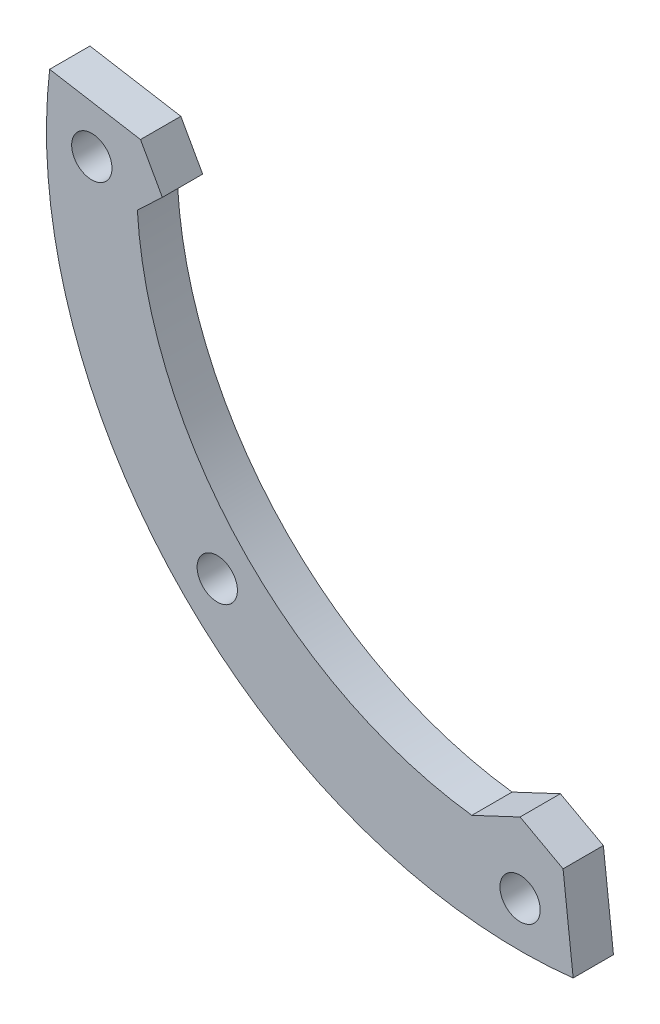
ISO-10303-21;
HEADER;
FILE_DESCRIPTION(('STEP AP214'),'2;1');
FILE_NAME('part.step','',(''),(''),'','','');
FILE_SCHEMA(('AUTOMOTIVE_DESIGN { 1 0 10303 214 1 1 1 1 }'));
ENDSEC;
DATA;
#1=APPLICATION_CONTEXT('core data for automotive mechanical design processes');
#2=APPLICATION_PROTOCOL_DEFINITION('international standard','automotive_design',2000,#1);
#3=PRODUCT_CONTEXT('',#1,'mechanical');
#4=PRODUCT('Part','Part','',(#3));
#5=PRODUCT_RELATED_PRODUCT_CATEGORY('part','',(#4));
#6=PRODUCT_DEFINITION_FORMATION('','',#4);
#7=PRODUCT_DEFINITION_CONTEXT('part definition',#1,'design');
#8=PRODUCT_DEFINITION('design','',#6,#7);
#9=PRODUCT_DEFINITION_SHAPE('','',#8);
#10=(LENGTH_UNIT() NAMED_UNIT(*) SI_UNIT(.MILLI.,.METRE.));
#11=(NAMED_UNIT(*) PLANE_ANGLE_UNIT() SI_UNIT($,.RADIAN.));
#12=(NAMED_UNIT(*) SI_UNIT($,.STERADIAN.) SOLID_ANGLE_UNIT());
#13=UNCERTAINTY_MEASURE_WITH_UNIT(LENGTH_MEASURE(1.E-05),#10,'distance_accuracy_value','');
#14=(GEOMETRIC_REPRESENTATION_CONTEXT(3) GLOBAL_UNCERTAINTY_ASSIGNED_CONTEXT((#13)) GLOBAL_UNIT_ASSIGNED_CONTEXT((#10,
#11,#12)) REPRESENTATION_CONTEXT('',''));
#15=CARTESIAN_POINT('',(0.,0.,0.));
#16=DIRECTION('',(0.,0.,1.));
#17=DIRECTION('',(1.,0.,0.));
#18=AXIS2_PLACEMENT_3D('',#15,#16,#17);
#19=CARTESIAN_POINT('',(0.,53.009783314729,4.));
#20=DIRECTION('',(0.,0.,1.));
#21=DIRECTION('',(1.,0.,0.));
#22=AXIS2_PLACEMENT_3D('',#19,#20,#21);
#23=PLANE('',#22);
#24=CARTESIAN_POINT('',(-30.0520382004283,22.9577451143008,4.));
#25=DIRECTION('',(0.,0.,1.));
#26=DIRECTION('',(1.,0.,0.));
#27=AXIS2_PLACEMENT_3D('',#24,#25,#26);
#28=CIRCLE('',#27,2.);
#29=CARTESIAN_POINT('',(-28.0520382004283,22.9577451143008,4.));
#30=VERTEX_POINT('',#29);
#31=EDGE_CURVE('E182',#30,#30,#28,.T.);
#32=ORIENTED_EDGE('',*,*,#31,.F.);
#33=EDGE_LOOP('',(#32));
#34=FACE_BOUND('',#33,.T.);
#35=DIRECTION('',(0.729145399655738,0.684358813898728,0.));
#36=VECTOR('',#35,1.);
#37=CARTESIAN_POINT('',(-35.5,53.0097833147292,4.));
#38=LINE('',#37,#36);
#39=CARTESIAN_POINT('',(-37.9833457303055,50.6789731096661,4.));
#40=VERTEX_POINT('',#39);
#41=CARTESIAN_POINT('',(-35.5,53.0097833147292,4.));
#42=VERTEX_POINT('',#41);
#43=EDGE_CURVE('E145',#40,#42,#38,.T.);
#44=ORIENTED_EDGE('',*,*,#43,.T.);
#45=DIRECTION('',(-0.486980783769737,0.873412683809328,0.));
#46=VECTOR('',#45,1.);
#47=CARTESIAN_POINT('',(-37.6674058612895,56.8970820199446,4.));
#48=LINE('',#47,#46);
#49=CARTESIAN_POINT('',(-37.6674058612895,56.8970820199446,4.));
#50=VERTEX_POINT('',#49);
#51=EDGE_CURVE('E93',#42,#50,#48,.T.);
#52=ORIENTED_EDGE('',*,*,#51,.T.);
#53=DIRECTION('',(-0.985929303058029,0.167162822934733,0.));
#54=VECTOR('',#53,1.);
#55=CARTESIAN_POINT('',(-37.6674058612895,56.8970820199446,4.));
#56=LINE('',#55,#54);
#57=CARTESIAN_POINT('',(-46.6868418083701,58.4263137503705,4.));
#58=VERTEX_POINT('',#57);
#59=EDGE_CURVE('E160',#50,#58,#56,.T.);
#60=ORIENTED_EDGE('',*,*,#59,.T.);
#61=CARTESIAN_POINT('',(0.,53.009783314729,4.));
#62=DIRECTION('',(0.,0.,1.));
#63=DIRECTION('',(-1.,0.,0.));
#64=AXIS2_PLACEMENT_3D('',#61,#62,#63);
#65=CIRCLE('',#64,47.);
#66=CARTESIAN_POINT('',(5.26727650502577,6.30586700978083,4.));
#67=VERTEX_POINT('',#66);
#68=EDGE_CURVE('E173',#58,#67,#65,.T.);
#69=ORIENTED_EDGE('',*,*,#68,.T.);
#70=DIRECTION('',(-0.112069712872889,0.993700346913791,0.));
#71=VECTOR('',#70,1.);
#72=CARTESIAN_POINT('',(4.26553777903046,15.1880894588341,4.));
#73=LINE('',#72,#71);
#74=CARTESIAN_POINT('',(4.26553777903046,15.1880894588341,4.));
#75=VERTEX_POINT('',#74);
#76=EDGE_CURVE('E112',#67,#75,#73,.T.);
#77=ORIENTED_EDGE('',*,*,#76,.T.);
#78=DIRECTION('',(-0.87832483509759,0.478064309534598,0.));
#79=VECTOR('',#78,1.);
#80=CARTESIAN_POINT('',(4.26553777903046,15.1880894588341,4.));
#81=LINE('',#80,#79);
#82=CARTESIAN_POINT('',(0.,17.509783314729,4.));
#83=VERTEX_POINT('',#82);
#84=EDGE_CURVE('E106',#75,#83,#81,.T.);
#85=ORIENTED_EDGE('',*,*,#84,.T.);
#86=DIRECTION('',(-0.904918159738496,-0.425585624963408,0.));
#87=VECTOR('',#86,1.);
#88=CARTESIAN_POINT('',(0.,17.509783314729,4.));
#89=LINE('',#88,#87);
#90=CARTESIAN_POINT('',(-4.7889561391317,15.257523406514,4.));
#91=VERTEX_POINT('',#90);
#92=EDGE_CURVE('E110',#83,#91,#89,.T.);
#93=ORIENTED_EDGE('',*,*,#92,.T.);
#94=CARTESIAN_POINT('',(0.,53.009783314729,4.));
#95=DIRECTION('',(0.,0.,-1.));
#96=DIRECTION('',(1.,0.,0.));
#97=AXIS2_PLACEMENT_3D('',#94,#95,#96);
#98=CIRCLE('',#97,38.0547924587685);
#99=EDGE_CURVE('E50',#91,#40,#98,.T.);
#100=ORIENTED_EDGE('',*,*,#99,.T.);
#101=EDGE_LOOP('',(#44,#52,#60,#69,#77,#85,#93,#100));
#102=FACE_BOUND('',#101,.T.);
#103=CARTESIAN_POINT('',(0.,10.509783314729,4.));
#104=DIRECTION('',(0.,0.,1.));
#105=DIRECTION('',(1.,0.,0.));
#106=AXIS2_PLACEMENT_3D('',#103,#104,#105);
#107=CIRCLE('',#106,2.);
#108=CARTESIAN_POINT('',(2.,10.509783314729,4.));
#109=VERTEX_POINT('',#108);
#110=EDGE_CURVE('E134',#109,#109,#107,.T.);
#111=ORIENTED_EDGE('',*,*,#110,.F.);
#112=EDGE_LOOP('',(#111));
#113=FACE_BOUND('',#112,.T.);
#114=CARTESIAN_POINT('',(-42.5,53.0097833147292,4.));
#115=DIRECTION('',(0.,0.,1.));
#116=DIRECTION('',(1.,0.,0.));
#117=AXIS2_PLACEMENT_3D('',#114,#115,#116);
#118=CIRCLE('',#117,2.);
#119=CARTESIAN_POINT('',(-40.5,53.0097833147292,4.));
#120=VERTEX_POINT('',#119);
#121=EDGE_CURVE('E188',#120,#120,#118,.T.);
#122=ORIENTED_EDGE('',*,*,#121,.F.);
#123=EDGE_LOOP('',(#122));
#124=FACE_BOUND('',#123,.T.);
#125=ADVANCED_FACE('F33',(#34,#102,#113,#124),#23,.T.);
#126=CARTESIAN_POINT('',(0.,53.009783314729,0.));
#127=DIRECTION('',(0.,0.,1.));
#128=DIRECTION('',(1.,0.,0.));
#129=AXIS2_PLACEMENT_3D('',#126,#127,#128);
#130=PLANE('',#129);
#131=DIRECTION('',(0.729145399655738,0.684358813898728,0.));
#132=VECTOR('',#131,1.);
#133=CARTESIAN_POINT('',(-35.5,53.0097833147292,0.));
#134=LINE('',#133,#132);
#135=CARTESIAN_POINT('',(-37.9833457303055,50.6789731096661,0.));
#136=VERTEX_POINT('',#135);
#137=CARTESIAN_POINT('',(-35.5,53.0097833147292,0.));
#138=VERTEX_POINT('',#137);
#139=EDGE_CURVE('E130',#136,#138,#134,.T.);
#140=ORIENTED_EDGE('',*,*,#139,.F.);
#141=CARTESIAN_POINT('',(0.,53.009783314729,0.));
#142=DIRECTION('',(0.,0.,-1.));
#143=DIRECTION('',(1.,0.,0.));
#144=AXIS2_PLACEMENT_3D('',#141,#142,#143);
#145=CIRCLE('',#144,38.0547924587685);
#146=CARTESIAN_POINT('',(-4.7889561391317,15.257523406514,0.));
#147=VERTEX_POINT('',#146);
#148=EDGE_CURVE('E85',#147,#136,#145,.T.);
#149=ORIENTED_EDGE('',*,*,#148,.F.);
#150=DIRECTION('',(-0.904918159738496,-0.425585624963408,0.));
#151=VECTOR('',#150,1.);
#152=CARTESIAN_POINT('',(0.,17.509783314729,0.));
#153=LINE('',#152,#151);
#154=CARTESIAN_POINT('',(0.,17.509783314729,0.));
#155=VERTEX_POINT('',#154);
#156=EDGE_CURVE('E79',#155,#147,#153,.T.);
#157=ORIENTED_EDGE('',*,*,#156,.F.);
#158=DIRECTION('',(-0.87832483509759,0.478064309534598,0.));
#159=VECTOR('',#158,1.);
#160=CARTESIAN_POINT('',(4.26553777903046,15.1880894588341,0.));
#161=LINE('',#160,#159);
#162=CARTESIAN_POINT('',(4.26553777903046,15.1880894588341,0.));
#163=VERTEX_POINT('',#162);
#164=EDGE_CURVE('E120',#163,#155,#161,.T.);
#165=ORIENTED_EDGE('',*,*,#164,.F.);
#166=DIRECTION('',(-0.112069712872889,0.993700346913791,0.));
#167=VECTOR('',#166,1.);
#168=CARTESIAN_POINT('',(4.26553777903046,15.1880894588341,0.));
#169=LINE('',#168,#167);
#170=CARTESIAN_POINT('',(5.26727650502577,6.30586700978083,0.));
#171=VERTEX_POINT('',#170);
#172=EDGE_CURVE('E140',#171,#163,#169,.T.);
#173=ORIENTED_EDGE('',*,*,#172,.F.);
#174=CARTESIAN_POINT('',(0.,53.009783314729,0.));
#175=DIRECTION('',(0.,0.,1.));
#176=DIRECTION('',(-1.,0.,0.));
#177=AXIS2_PLACEMENT_3D('',#174,#175,#176);
#178=CIRCLE('',#177,47.);
#179=CARTESIAN_POINT('',(-46.6868418083701,58.4263137503705,0.));
#180=VERTEX_POINT('',#179);
#181=EDGE_CURVE('E138',#180,#171,#178,.T.);
#182=ORIENTED_EDGE('',*,*,#181,.F.);
#183=DIRECTION('',(-0.985929303058029,0.167162822934733,0.));
#184=VECTOR('',#183,1.);
#185=CARTESIAN_POINT('',(-37.6674058612895,56.8970820199446,0.));
#186=LINE('',#185,#184);
#187=CARTESIAN_POINT('',(-37.6674058612895,56.8970820199446,0.));
#188=VERTEX_POINT('',#187);
#189=EDGE_CURVE('E136',#188,#180,#186,.T.);
#190=ORIENTED_EDGE('',*,*,#189,.F.);
#191=DIRECTION('',(-0.486980783769737,0.873412683809328,0.));
#192=VECTOR('',#191,1.);
#193=CARTESIAN_POINT('',(-37.6674058612895,56.8970820199446,0.));
#194=LINE('',#193,#192);
#195=EDGE_CURVE('E133',#138,#188,#194,.T.);
#196=ORIENTED_EDGE('',*,*,#195,.F.);
#197=EDGE_LOOP('',(#140,#149,#157,#165,#173,#182,#190,#196));
#198=FACE_BOUND('',#197,.T.);
#199=CARTESIAN_POINT('',(0.,10.509783314729,0.));
#200=DIRECTION('',(0.,0.,1.));
#201=DIRECTION('',(1.,0.,0.));
#202=AXIS2_PLACEMENT_3D('',#199,#200,#201);
#203=CIRCLE('',#202,2.);
#204=CARTESIAN_POINT('',(2.,10.509783314729,0.));
#205=VERTEX_POINT('',#204);
#206=EDGE_CURVE('E179',#205,#205,#203,.T.);
#207=ORIENTED_EDGE('',*,*,#206,.T.);
#208=EDGE_LOOP('',(#207));
#209=FACE_BOUND('',#208,.T.);
#210=CARTESIAN_POINT('',(-30.0520382004283,22.9577451143008,0.));
#211=DIRECTION('',(0.,0.,1.));
#212=DIRECTION('',(1.,0.,0.));
#213=AXIS2_PLACEMENT_3D('',#210,#211,#212);
#214=CIRCLE('',#213,2.);
#215=CARTESIAN_POINT('',(-28.0520382004283,22.9577451143008,0.));
#216=VERTEX_POINT('',#215);
#217=EDGE_CURVE('E185',#216,#216,#214,.T.);
#218=ORIENTED_EDGE('',*,*,#217,.T.);
#219=EDGE_LOOP('',(#218));
#220=FACE_BOUND('',#219,.T.);
#221=CARTESIAN_POINT('',(-42.5,53.0097833147292,0.));
#222=DIRECTION('',(0.,0.,1.));
#223=DIRECTION('',(1.,0.,0.));
#224=AXIS2_PLACEMENT_3D('',#221,#222,#223);
#225=CIRCLE('',#224,2.);
#226=CARTESIAN_POINT('',(-40.5,53.0097833147292,0.));
#227=VERTEX_POINT('',#226);
#228=EDGE_CURVE('E191',#227,#227,#225,.T.);
#229=ORIENTED_EDGE('',*,*,#228,.T.);
#230=EDGE_LOOP('',(#229));
#231=FACE_BOUND('',#230,.T.);
#232=ADVANCED_FACE('F164',(#198,#209,#220,#231),#130,.F.);
#233=CARTESIAN_POINT('',(-35.5,53.0097833147292,4.));
#234=DIRECTION('',(-0.684358813898728,0.729145399655738,0.));
#235=DIRECTION('',(-0.729145399655738,-0.684358813898728,0.));
#236=AXIS2_PLACEMENT_3D('',#233,#234,#235);
#237=PLANE('',#236);
#238=ORIENTED_EDGE('',*,*,#139,.T.);
#239=DIRECTION('',(0.,0.,-1.));
#240=VECTOR('',#239,1.);
#241=CARTESIAN_POINT('',(-35.5,53.0097833147292,4.));
#242=LINE('',#241,#240);
#243=EDGE_CURVE('E11',#42,#138,#242,.T.);
#244=ORIENTED_EDGE('',*,*,#243,.F.);
#245=ORIENTED_EDGE('',*,*,#43,.F.);
#246=DIRECTION('',(0.,0.,-1.));
#247=VECTOR('',#246,1.);
#248=CARTESIAN_POINT('',(-37.9833457303055,50.6789731096661,4.));
#249=LINE('',#248,#247);
#250=EDGE_CURVE('E126',#40,#136,#249,.T.);
#251=ORIENTED_EDGE('',*,*,#250,.T.);
#252=EDGE_LOOP('',(#238,#244,#245,#251));
#253=FACE_BOUND('',#252,.T.);
#254=ADVANCED_FACE('F35',(#253),#237,.F.);
#255=CARTESIAN_POINT('',(-37.6674058612895,56.8970820199446,4.));
#256=DIRECTION('',(-0.873412683809328,-0.486980783769737,0.));
#257=DIRECTION('',(0.486980783769737,-0.873412683809328,0.));
#258=AXIS2_PLACEMENT_3D('',#255,#256,#257);
#259=PLANE('',#258);
#260=ORIENTED_EDGE('',*,*,#195,.T.);
#261=DIRECTION('',(0.,0.,-1.));
#262=VECTOR('',#261,1.);
#263=CARTESIAN_POINT('',(-37.6674058612895,56.8970820199446,4.));
#264=LINE('',#263,#262);
#265=EDGE_CURVE('E42',#50,#188,#264,.T.);
#266=ORIENTED_EDGE('',*,*,#265,.F.);
#267=ORIENTED_EDGE('',*,*,#51,.F.);
#268=ORIENTED_EDGE('',*,*,#243,.T.);
#269=EDGE_LOOP('',(#260,#266,#267,#268));
#270=FACE_BOUND('',#269,.T.);
#271=ADVANCED_FACE('F224',(#270),#259,.F.);
#272=CARTESIAN_POINT('',(-37.6674058612895,56.8970820199446,4.));
#273=DIRECTION('',(-0.167162822934733,-0.985929303058029,0.));
#274=DIRECTION('',(0.985929303058029,-0.167162822934733,0.));
#275=AXIS2_PLACEMENT_3D('',#272,#273,#274);
#276=PLANE('',#275);
#277=ORIENTED_EDGE('',*,*,#189,.T.);
#278=DIRECTION('',(0.,0.,-1.));
#279=VECTOR('',#278,1.);
#280=CARTESIAN_POINT('',(-46.6868418083701,58.4263137503705,4.));
#281=LINE('',#280,#279);
#282=EDGE_CURVE('E152',#58,#180,#281,.T.);
#283=ORIENTED_EDGE('',*,*,#282,.F.);
#284=ORIENTED_EDGE('',*,*,#59,.F.);
#285=ORIENTED_EDGE('',*,*,#265,.T.);
#286=EDGE_LOOP('',(#277,#283,#284,#285));
#287=FACE_BOUND('',#286,.T.);
#288=ADVANCED_FACE('F158',(#287),#276,.F.);
#289=CARTESIAN_POINT('',(0.,53.009783314729,4.));
#290=DIRECTION('',(0.,0.,-1.));
#291=DIRECTION('',(-1.,0.,0.));
#292=AXIS2_PLACEMENT_3D('',#289,#290,#291);
#293=CYLINDRICAL_SURFACE('',#292,47.);
#294=ORIENTED_EDGE('',*,*,#181,.T.);
#295=DIRECTION('',(0.,0.,-1.));
#296=VECTOR('',#295,1.);
#297=CARTESIAN_POINT('',(5.26727650502577,6.30586700978083,4.));
#298=LINE('',#297,#296);
#299=EDGE_CURVE('E149',#67,#171,#298,.T.);
#300=ORIENTED_EDGE('',*,*,#299,.F.);
#301=ORIENTED_EDGE('',*,*,#68,.F.);
#302=ORIENTED_EDGE('',*,*,#282,.T.);
#303=EDGE_LOOP('',(#294,#300,#301,#302));
#304=FACE_BOUND('',#303,.T.);
#305=ADVANCED_FACE('F169',(#304),#293,.T.);
#306=CARTESIAN_POINT('',(4.26553777903046,15.1880894588341,4.));
#307=DIRECTION('',(-0.993700346913791,-0.112069712872889,0.));
#308=DIRECTION('',(0.112069712872889,-0.993700346913791,0.));
#309=AXIS2_PLACEMENT_3D('',#306,#307,#308);
#310=PLANE('',#309);
#311=ORIENTED_EDGE('',*,*,#172,.T.);
#312=DIRECTION('',(0.,0.,-1.));
#313=VECTOR('',#312,1.);
#314=CARTESIAN_POINT('',(4.26553777903046,15.1880894588341,4.));
#315=LINE('',#314,#313);
#316=EDGE_CURVE('E121',#75,#163,#315,.T.);
#317=ORIENTED_EDGE('',*,*,#316,.F.);
#318=ORIENTED_EDGE('',*,*,#76,.F.);
#319=ORIENTED_EDGE('',*,*,#299,.T.);
#320=EDGE_LOOP('',(#311,#317,#318,#319));
#321=FACE_BOUND('',#320,.T.);
#322=ADVANCED_FACE('F172',(#321),#310,.F.);
#323=CARTESIAN_POINT('',(4.26553777903046,15.1880894588341,4.));
#324=DIRECTION('',(-0.478064309534598,-0.87832483509759,0.));
#325=DIRECTION('',(0.87832483509759,-0.478064309534598,0.));
#326=AXIS2_PLACEMENT_3D('',#323,#324,#325);
#327=PLANE('',#326);
#328=ORIENTED_EDGE('',*,*,#164,.T.);
#329=DIRECTION('',(0.,0.,-1.));
#330=VECTOR('',#329,1.);
#331=CARTESIAN_POINT('',(0.,17.509783314729,4.));
#332=LINE('',#331,#330);
#333=EDGE_CURVE('E117',#83,#155,#332,.T.);
#334=ORIENTED_EDGE('',*,*,#333,.F.);
#335=ORIENTED_EDGE('',*,*,#84,.F.);
#336=ORIENTED_EDGE('',*,*,#316,.T.);
#337=EDGE_LOOP('',(#328,#334,#335,#336));
#338=FACE_BOUND('',#337,.T.);
#339=ADVANCED_FACE('F118',(#338),#327,.F.);
#340=CARTESIAN_POINT('',(0.,17.509783314729,4.));
#341=DIRECTION('',(0.425585624963408,-0.904918159738496,0.));
#342=DIRECTION('',(0.904918159738496,0.425585624963408,0.));
#343=AXIS2_PLACEMENT_3D('',#340,#341,#342);
#344=PLANE('',#343);
#345=ORIENTED_EDGE('',*,*,#156,.T.);
#346=DIRECTION('',(0.,0.,-1.));
#347=VECTOR('',#346,1.);
#348=CARTESIAN_POINT('',(-4.7889561391317,15.257523406514,4.));
#349=LINE('',#348,#347);
#350=EDGE_CURVE('E122',#91,#147,#349,.T.);
#351=ORIENTED_EDGE('',*,*,#350,.F.);
#352=ORIENTED_EDGE('',*,*,#92,.F.);
#353=ORIENTED_EDGE('',*,*,#333,.T.);
#354=EDGE_LOOP('',(#345,#351,#352,#353));
#355=FACE_BOUND('',#354,.T.);
#356=ADVANCED_FACE('F124',(#355),#344,.F.);
#357=CARTESIAN_POINT('',(0.,53.009783314729,4.));
#358=DIRECTION('',(0.,0.,-1.));
#359=DIRECTION('',(-1.,0.,0.));
#360=AXIS2_PLACEMENT_3D('',#357,#358,#359);
#361=CYLINDRICAL_SURFACE('',#360,38.0547924587685);
#362=ORIENTED_EDGE('',*,*,#148,.T.);
#363=ORIENTED_EDGE('',*,*,#250,.F.);
#364=ORIENTED_EDGE('',*,*,#99,.F.);
#365=ORIENTED_EDGE('',*,*,#350,.T.);
#366=EDGE_LOOP('',(#362,#363,#364,#365));
#367=FACE_BOUND('',#366,.T.);
#368=ADVANCED_FACE('F212',(#367),#361,.F.);
#369=CARTESIAN_POINT('',(0.,10.509783314729,4.));
#370=DIRECTION('',(0.,0.,-1.));
#371=DIRECTION('',(-1.,0.,0.));
#372=AXIS2_PLACEMENT_3D('',#369,#370,#371);
#373=CYLINDRICAL_SURFACE('',#372,2.);
#374=ORIENTED_EDGE('',*,*,#110,.T.);
#375=EDGE_LOOP('',(#374));
#376=FACE_BOUND('',#375,.T.);
#377=ORIENTED_EDGE('',*,*,#206,.F.);
#378=EDGE_LOOP('',(#377));
#379=FACE_BOUND('',#378,.T.);
#380=ADVANCED_FACE('F209',(#376,#379),#373,.F.);
#381=CARTESIAN_POINT('',(-30.0520382004283,22.9577451143008,4.));
#382=DIRECTION('',(0.,0.,-1.));
#383=DIRECTION('',(-1.,0.,0.));
#384=AXIS2_PLACEMENT_3D('',#381,#382,#383);
#385=CYLINDRICAL_SURFACE('',#384,2.);
#386=ORIENTED_EDGE('',*,*,#31,.T.);
#387=EDGE_LOOP('',(#386));
#388=FACE_BOUND('',#387,.T.);
#389=ORIENTED_EDGE('',*,*,#217,.F.);
#390=EDGE_LOOP('',(#389));
#391=FACE_BOUND('',#390,.T.);
#392=ADVANCED_FACE('F288',(#388,#391),#385,.F.);
#393=CARTESIAN_POINT('',(-42.5,53.0097833147292,4.));
#394=DIRECTION('',(0.,0.,-1.));
#395=DIRECTION('',(-1.,0.,0.));
#396=AXIS2_PLACEMENT_3D('',#393,#394,#395);
#397=CYLINDRICAL_SURFACE('',#396,2.);
#398=ORIENTED_EDGE('',*,*,#121,.T.);
#399=EDGE_LOOP('',(#398));
#400=FACE_BOUND('',#399,.T.);
#401=ORIENTED_EDGE('',*,*,#228,.F.);
#402=EDGE_LOOP('',(#401));
#403=FACE_BOUND('',#402,.T.);
#404=ADVANCED_FACE('F197',(#400,#403),#397,.F.);
#405=CLOSED_SHELL('',(#125,#232,#254,#271,#288,#305,#322,#339,#356,#368,#380,#392,#404));
#406=MANIFOLD_SOLID_BREP('B2',#405);
#407=ADVANCED_BREP_SHAPE_REPRESENTATION('',(#18,#406),#14);
#408=SHAPE_DEFINITION_REPRESENTATION(#9,#407);
ENDSEC;
END-ISO-10303-21;
